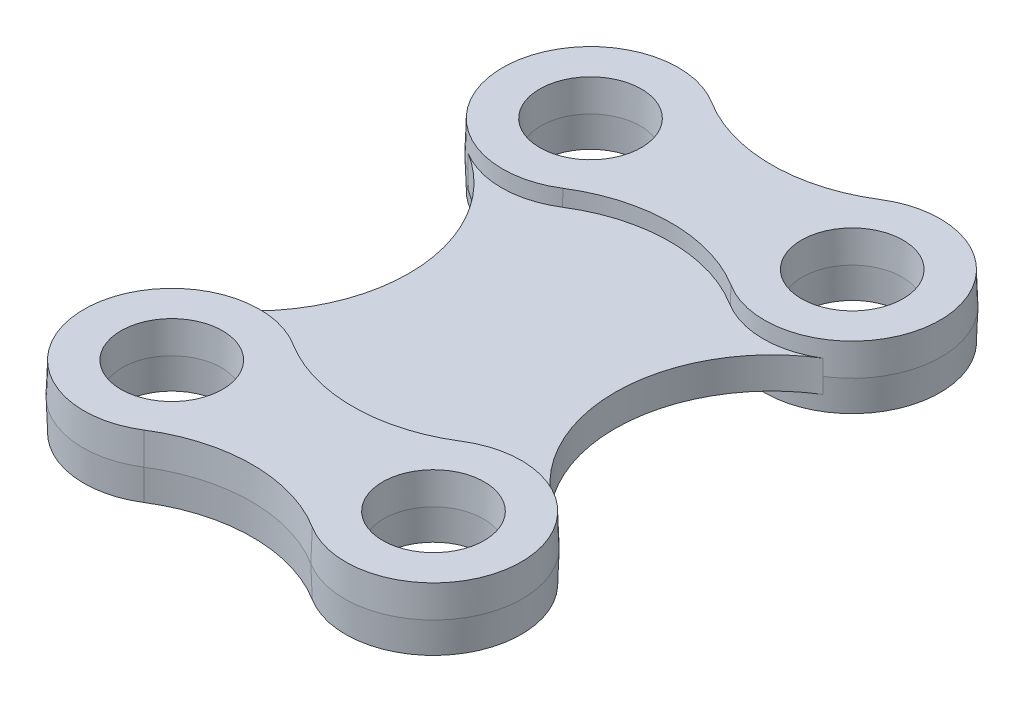
ISO-10303-21;
HEADER;
FILE_DESCRIPTION(('STEP AP214'),'2;1');
FILE_NAME('part.step','',(''),(''),'','','');
FILE_SCHEMA(('AUTOMOTIVE_DESIGN { 1 0 10303 214 1 1 1 1 }'));
ENDSEC;
DATA;
#1=APPLICATION_CONTEXT('core data for automotive mechanical design processes');
#2=APPLICATION_PROTOCOL_DEFINITION('international standard','automotive_design',2000,#1);
#3=PRODUCT_CONTEXT('',#1,'mechanical');
#4=PRODUCT('Part','Part','',(#3));
#5=PRODUCT_RELATED_PRODUCT_CATEGORY('part','',(#4));
#6=PRODUCT_DEFINITION_FORMATION('','',#4);
#7=PRODUCT_DEFINITION_CONTEXT('part definition',#1,'design');
#8=PRODUCT_DEFINITION('design','',#6,#7);
#9=PRODUCT_DEFINITION_SHAPE('','',#8);
#10=(LENGTH_UNIT() NAMED_UNIT(*) SI_UNIT(.MILLI.,.METRE.));
#11=(NAMED_UNIT(*) PLANE_ANGLE_UNIT() SI_UNIT($,.RADIAN.));
#12=(NAMED_UNIT(*) SI_UNIT($,.STERADIAN.) SOLID_ANGLE_UNIT());
#13=UNCERTAINTY_MEASURE_WITH_UNIT(LENGTH_MEASURE(1.E-05),#10,'distance_accuracy_value','');
#14=(GEOMETRIC_REPRESENTATION_CONTEXT(3) GLOBAL_UNCERTAINTY_ASSIGNED_CONTEXT((#13)) GLOBAL_UNIT_ASSIGNED_CONTEXT((#10,
#11,#12)) REPRESENTATION_CONTEXT('',''));
#15=CARTESIAN_POINT('',(0.,0.,0.));
#16=DIRECTION('',(0.,0.,1.));
#17=DIRECTION('',(1.,0.,0.));
#18=AXIS2_PLACEMENT_3D('',#15,#16,#17);
#19=CARTESIAN_POINT('',(0.,0.,0.200502515735196));
#20=DIRECTION('',(0.,-1.,0.));
#21=DIRECTION('',(0.,0.,1.));
#22=AXIS2_PLACEMENT_3D('',#19,#20,#21);
#23=CONICAL_SURFACE('',#22,30.,0.0349065850398867);
#24=CARTESIAN_POINT('',(0.,0.,0.200502515735196));
#25=DIRECTION('',(0.,1.,0.));
#26=DIRECTION('',(0.,0.,1.));
#27=AXIS2_PLACEMENT_3D('',#24,#25,#26);
#28=CIRCLE('',#27,30.);
#29=CARTESIAN_POINT('',(-15.9574468085106,0.,25.6044370801595));
#30=VERTEX_POINT('',#29);
#31=CARTESIAN_POINT('',(15.9574468085106,0.,25.6044370801595));
#32=VERTEX_POINT('',#31);
#33=EDGE_CURVE('E119',#30,#32,#28,.T.);
#34=ORIENTED_EDGE('',*,*,#33,.T.);
#35=DIRECTION('',(-0.0185635620757984,0.999390827019096,-0.0295528176853893));
#36=VECTOR('',#35,1.);
#37=CARTESIAN_POINT('',(15.9574468085107,0.,25.6044370801595));
#38=LINE('',#37,#36);
#39=CARTESIAN_POINT('',(16.068896072846,-6.,25.7818620687811));
#40=VERTEX_POINT('',#39);
#41=EDGE_CURVE('E12',#40,#32,#38,.T.);
#42=ORIENTED_EDGE('',*,*,#41,.F.);
#43=CARTESIAN_POINT('',(0.,-6.,0.200502515735196));
#44=DIRECTION('',(0.,1.,0.));
#45=DIRECTION('',(0.,0.,1.));
#46=AXIS2_PLACEMENT_3D('',#43,#44,#45);
#47=CIRCLE('',#46,30.2095246169505);
#48=CARTESIAN_POINT('',(-16.068896072846,-6.,25.7818620687811));
#49=VERTEX_POINT('',#48);
#50=EDGE_CURVE('E76',#49,#40,#47,.T.);
#51=ORIENTED_EDGE('',*,*,#50,.F.);
#52=DIRECTION('',(0.0185635620757984,0.999390827019096,-0.0295528176853893));
#53=VECTOR('',#52,1.);
#54=CARTESIAN_POINT('',(-15.9574468085106,0.,25.6044370801595));
#55=LINE('',#54,#53);
#56=EDGE_CURVE('E121',#49,#30,#55,.T.);
#57=ORIENTED_EDGE('',*,*,#56,.T.);
#58=EDGE_LOOP('',(#34,#42,#51,#57));
#59=FACE_BOUND('',#58,.T.);
#60=ADVANCED_FACE('F56',(#59),#23,.F.);
#61=CARTESIAN_POINT('',(25.,0.,40.));
#62=DIRECTION('',(0.,1.,0.));
#63=DIRECTION('',(0.,0.,1.));
#64=AXIS2_PLACEMENT_3D('',#61,#62,#63);
#65=CONICAL_SURFACE('',#64,17.,0.0349065850398867);
#66=CARTESIAN_POINT('',(25.,0.,40.));
#67=DIRECTION('',(0.,1.,0.));
#68=DIRECTION('',(0.,0.,1.));
#69=AXIS2_PLACEMENT_3D('',#66,#67,#68);
#70=CIRCLE('',#69,17.);
#71=CARTESIAN_POINT('',(15.9574468085106,0.,54.3955629198405));
#72=VERTEX_POINT('',#71);
#73=EDGE_CURVE('E132',#72,#32,#70,.T.);
#74=ORIENTED_EDGE('',*,*,#73,.F.);
#75=DIRECTION('',(-0.0185635620757984,0.999390827019096,0.0295528176853893));
#76=VECTOR('',#75,1.);
#77=CARTESIAN_POINT('',(15.9574468085106,0.,54.3955629198405));
#78=LINE('',#77,#76);
#79=CARTESIAN_POINT('',(16.068896072846,-6.,54.2181379312189));
#80=VERTEX_POINT('',#79);
#81=EDGE_CURVE('E67',#80,#72,#78,.T.);
#82=ORIENTED_EDGE('',*,*,#81,.F.);
#83=CARTESIAN_POINT('',(25.,-6.,40.));
#84=DIRECTION('',(0.,1.,0.));
#85=DIRECTION('',(0.,0.,1.));
#86=AXIS2_PLACEMENT_3D('',#83,#84,#85);
#87=CIRCLE('',#86,16.7904753830495);
#88=EDGE_CURVE('E134',#80,#40,#87,.T.);
#89=ORIENTED_EDGE('',*,*,#88,.T.);
#90=ORIENTED_EDGE('',*,*,#41,.T.);
#91=EDGE_LOOP('',(#74,#82,#89,#90));
#92=FACE_BOUND('',#91,.T.);
#93=ADVANCED_FACE('F130',(#92),#65,.T.);
#94=CARTESIAN_POINT('',(0.,0.,79.7994974842648));
#95=DIRECTION('',(0.,-1.,0.));
#96=DIRECTION('',(0.,0.,1.));
#97=AXIS2_PLACEMENT_3D('',#94,#95,#96);
#98=CONICAL_SURFACE('',#97,30.,0.0349065850398867);
#99=CARTESIAN_POINT('',(0.,0.,79.7994974842648));
#100=DIRECTION('',(0.,1.,0.));
#101=DIRECTION('',(0.,0.,1.));
#102=AXIS2_PLACEMENT_3D('',#99,#100,#101);
#103=CIRCLE('',#102,30.);
#104=CARTESIAN_POINT('',(-15.9574468085106,0.,54.3955629198405));
#105=VERTEX_POINT('',#104);
#106=EDGE_CURVE('E152',#105,#72,#103,.F.);
#107=ORIENTED_EDGE('',*,*,#106,.F.);
#108=DIRECTION('',(0.0185635620757984,0.999390827019096,0.0295528176853893));
#109=VECTOR('',#108,1.);
#110=CARTESIAN_POINT('',(-15.9574468085106,0.,54.3955629198405));
#111=LINE('',#110,#109);
#112=CARTESIAN_POINT('',(-16.068896072846,-6.,54.2181379312189));
#113=VERTEX_POINT('',#112);
#114=EDGE_CURVE('E89',#113,#105,#111,.T.);
#115=ORIENTED_EDGE('',*,*,#114,.F.);
#116=CARTESIAN_POINT('',(0.,-6.,79.7994974842648));
#117=DIRECTION('',(0.,1.,0.));
#118=DIRECTION('',(0.,0.,1.));
#119=AXIS2_PLACEMENT_3D('',#116,#117,#118);
#120=CIRCLE('',#119,30.2095246169505);
#121=EDGE_CURVE('E172',#113,#80,#120,.F.);
#122=ORIENTED_EDGE('',*,*,#121,.T.);
#123=ORIENTED_EDGE('',*,*,#81,.T.);
#124=EDGE_LOOP('',(#107,#115,#122,#123));
#125=FACE_BOUND('',#124,.T.);
#126=ADVANCED_FACE('F191',(#125),#98,.F.);
#127=CARTESIAN_POINT('',(25.,0.,40.));
#128=DIRECTION('',(0.,-1.,0.));
#129=DIRECTION('',(0.,0.,1.));
#130=AXIS2_PLACEMENT_3D('',#127,#128,#129);
#131=CONICAL_SURFACE('',#130,9.5,0.0349065850398867);
#132=CARTESIAN_POINT('',(25.,-6.,40.));
#133=DIRECTION('',(0.,1.,0.));
#134=DIRECTION('',(0.,0.,1.));
#135=AXIS2_PLACEMENT_3D('',#132,#133,#134);
#136=CIRCLE('',#135,9.70952461695049);
#137=CARTESIAN_POINT('',(25.,-6.,49.7095246169505));
#138=VERTEX_POINT('',#137);
#139=EDGE_CURVE('E60',#138,#138,#136,.T.);
#140=ORIENTED_EDGE('',*,*,#139,.F.);
#141=EDGE_LOOP('',(#140));
#142=FACE_BOUND('',#141,.T.);
#143=CARTESIAN_POINT('',(25.,0.,40.));
#144=DIRECTION('',(0.,1.,0.));
#145=DIRECTION('',(0.,0.,1.));
#146=AXIS2_PLACEMENT_3D('',#143,#144,#145);
#147=CIRCLE('',#146,9.5);
#148=CARTESIAN_POINT('',(25.,0.,49.5));
#149=VERTEX_POINT('',#148);
#150=EDGE_CURVE('E194',#149,#149,#147,.T.);
#151=ORIENTED_EDGE('',*,*,#150,.T.);
#152=EDGE_LOOP('',(#151));
#153=FACE_BOUND('',#152,.T.);
#154=ADVANCED_FACE('F187',(#142,#153),#131,.F.);
#155=CARTESIAN_POINT('',(-25.,0.,40.));
#156=DIRECTION('',(0.,1.,0.));
#157=DIRECTION('',(0.,0.,1.));
#158=AXIS2_PLACEMENT_3D('',#155,#156,#157);
#159=CONICAL_SURFACE('',#158,17.,0.0349065850398867);
#160=CARTESIAN_POINT('',(-25.,0.,40.));
#161=DIRECTION('',(0.,1.,0.));
#162=DIRECTION('',(0.,0.,1.));
#163=AXIS2_PLACEMENT_3D('',#160,#161,#162);
#164=CIRCLE('',#163,17.);
#165=EDGE_CURVE('E126',#105,#30,#164,.F.);
#166=ORIENTED_EDGE('',*,*,#165,.T.);
#167=ORIENTED_EDGE('',*,*,#56,.F.);
#168=CARTESIAN_POINT('',(-25.,-6.,40.));
#169=DIRECTION('',(0.,1.,0.));
#170=DIRECTION('',(0.,0.,1.));
#171=AXIS2_PLACEMENT_3D('',#168,#169,#170);
#172=CIRCLE('',#171,16.7904753830495);
#173=EDGE_CURVE('E92',#113,#49,#172,.F.);
#174=ORIENTED_EDGE('',*,*,#173,.F.);
#175=ORIENTED_EDGE('',*,*,#114,.T.);
#176=EDGE_LOOP('',(#166,#167,#174,#175));
#177=FACE_BOUND('',#176,.T.);
#178=ADVANCED_FACE('F190',(#177),#159,.T.);
#179=CARTESIAN_POINT('',(-25.,0.,40.));
#180=DIRECTION('',(0.,-1.,0.));
#181=DIRECTION('',(0.,0.,1.));
#182=AXIS2_PLACEMENT_3D('',#179,#180,#181);
#183=CONICAL_SURFACE('',#182,9.5,0.0349065850398867);
#184=CARTESIAN_POINT('',(-25.,-6.,40.));
#185=DIRECTION('',(0.,1.,0.));
#186=DIRECTION('',(0.,0.,1.));
#187=AXIS2_PLACEMENT_3D('',#184,#185,#186);
#188=CIRCLE('',#187,9.70952461695049);
#189=CARTESIAN_POINT('',(-25.,-6.,49.7095246169505));
#190=VERTEX_POINT('',#189);
#191=EDGE_CURVE('E163',#190,#190,#188,.F.);
#192=ORIENTED_EDGE('',*,*,#191,.T.);
#193=EDGE_LOOP('',(#192));
#194=FACE_BOUND('',#193,.T.);
#195=CARTESIAN_POINT('',(-25.,0.,40.));
#196=DIRECTION('',(0.,1.,0.));
#197=DIRECTION('',(0.,0.,1.));
#198=AXIS2_PLACEMENT_3D('',#195,#196,#197);
#199=CIRCLE('',#198,9.5);
#200=CARTESIAN_POINT('',(-25.,0.,49.5));
#201=VERTEX_POINT('',#200);
#202=EDGE_CURVE('E151',#201,#201,#199,.F.);
#203=ORIENTED_EDGE('',*,*,#202,.F.);
#204=EDGE_LOOP('',(#203));
#205=FACE_BOUND('',#204,.T.);
#206=ADVANCED_FACE('F58',(#194,#205),#183,.F.);
#207=CARTESIAN_POINT('',(0.,-6.,0.));
#208=DIRECTION('',(0.,1.,0.));
#209=DIRECTION('',(0.,0.,1.));
#210=AXIS2_PLACEMENT_3D('',#207,#208,#209);
#211=PLANE('',#210);
#212=ORIENTED_EDGE('',*,*,#50,.T.);
#213=ORIENTED_EDGE('',*,*,#88,.F.);
#214=ORIENTED_EDGE('',*,*,#121,.F.);
#215=ORIENTED_EDGE('',*,*,#173,.T.);
#216=EDGE_LOOP('',(#212,#213,#214,#215));
#217=FACE_BOUND('',#216,.T.);
#218=ORIENTED_EDGE('',*,*,#139,.T.);
#219=EDGE_LOOP('',(#218));
#220=FACE_BOUND('',#219,.T.);
#221=ORIENTED_EDGE('',*,*,#191,.F.);
#222=EDGE_LOOP('',(#221));
#223=FACE_BOUND('',#222,.T.);
#224=ADVANCED_FACE('F184',(#217,#220,#223),#211,.F.);
#225=CARTESIAN_POINT('',(0.,0.,0.200502515735196));
#226=DIRECTION('',(0.,1.,0.));
#227=DIRECTION('',(0.,0.,1.));
#228=AXIS2_PLACEMENT_3D('',#225,#226,#227);
#229=CONICAL_SURFACE('',#228,30.,0.0349065850398867);
#230=ORIENTED_EDGE('',*,*,#33,.F.);
#231=DIRECTION('',(0.0185635620757984,-0.999390827019096,-0.0295528176853893));
#232=VECTOR('',#231,1.);
#233=CARTESIAN_POINT('',(-15.9574468085106,0.,25.6044370801595));
#234=LINE('',#233,#232);
#235=CARTESIAN_POINT('',(-16.068896072846,6.,25.7818620687811));
#236=VERTEX_POINT('',#235);
#237=EDGE_CURVE('E127',#236,#30,#234,.T.);
#238=ORIENTED_EDGE('',*,*,#237,.F.);
#239=CARTESIAN_POINT('',(0.,6.,0.200502515735196));
#240=DIRECTION('',(0.,1.,0.));
#241=DIRECTION('',(0.,0.,1.));
#242=AXIS2_PLACEMENT_3D('',#239,#240,#241);
#243=CIRCLE('',#242,30.2095246169505);
#244=CARTESIAN_POINT('',(16.068896072846,6.,25.7818620687811));
#245=VERTEX_POINT('',#244);
#246=EDGE_CURVE('E140',#236,#245,#243,.T.);
#247=ORIENTED_EDGE('',*,*,#246,.T.);
#248=DIRECTION('',(-0.0185635620757984,-0.999390827019096,-0.0295528176853893));
#249=VECTOR('',#248,1.);
#250=CARTESIAN_POINT('',(15.9574468085106,0.,25.6044370801595));
#251=LINE('',#250,#249);
#252=EDGE_CURVE('E137',#245,#32,#251,.T.);
#253=ORIENTED_EDGE('',*,*,#252,.T.);
#254=EDGE_LOOP('',(#230,#238,#247,#253));
#255=FACE_BOUND('',#254,.T.);
#256=ADVANCED_FACE('F138',(#255),#229,.F.);
#257=CARTESIAN_POINT('',(-25.,0.,40.));
#258=DIRECTION('',(0.,-1.,0.));
#259=DIRECTION('',(0.,0.,1.));
#260=AXIS2_PLACEMENT_3D('',#257,#258,#259);
#261=CONICAL_SURFACE('',#260,17.,0.0349065850398867);
#262=ORIENTED_EDGE('',*,*,#165,.F.);
#263=DIRECTION('',(0.0185635620757984,-0.999390827019096,0.0295528176853893));
#264=VECTOR('',#263,1.);
#265=CARTESIAN_POINT('',(-15.9574468085106,0.,54.3955629198405));
#266=LINE('',#265,#264);
#267=CARTESIAN_POINT('',(-16.068896072846,6.,54.2181379312189));
#268=VERTEX_POINT('',#267);
#269=EDGE_CURVE('E203',#268,#105,#266,.T.);
#270=ORIENTED_EDGE('',*,*,#269,.F.);
#271=CARTESIAN_POINT('',(-25.,6.,40.));
#272=DIRECTION('',(0.,1.,0.));
#273=DIRECTION('',(0.,0.,1.));
#274=AXIS2_PLACEMENT_3D('',#271,#272,#273);
#275=CIRCLE('',#274,16.7904753830495);
#276=EDGE_CURVE('E199',#268,#236,#275,.F.);
#277=ORIENTED_EDGE('',*,*,#276,.T.);
#278=ORIENTED_EDGE('',*,*,#237,.T.);
#279=EDGE_LOOP('',(#262,#270,#277,#278));
#280=FACE_BOUND('',#279,.T.);
#281=ADVANCED_FACE('F228',(#280),#261,.T.);
#282=CARTESIAN_POINT('',(0.,0.,79.7994974842648));
#283=DIRECTION('',(0.,1.,0.));
#284=DIRECTION('',(0.,0.,1.));
#285=AXIS2_PLACEMENT_3D('',#282,#283,#284);
#286=CONICAL_SURFACE('',#285,30.,0.0349065850398867);
#287=ORIENTED_EDGE('',*,*,#106,.T.);
#288=DIRECTION('',(-0.0185635620757984,-0.999390827019096,0.0295528176853893));
#289=VECTOR('',#288,1.);
#290=CARTESIAN_POINT('',(15.9574468085106,0.,54.3955629198405));
#291=LINE('',#290,#289);
#292=CARTESIAN_POINT('',(16.068896072846,6.,54.2181379312189));
#293=VERTEX_POINT('',#292);
#294=EDGE_CURVE('E144',#293,#72,#291,.T.);
#295=ORIENTED_EDGE('',*,*,#294,.F.);
#296=CARTESIAN_POINT('',(0.,6.,79.7994974842648));
#297=DIRECTION('',(0.,1.,0.));
#298=DIRECTION('',(0.,0.,1.));
#299=AXIS2_PLACEMENT_3D('',#296,#297,#298);
#300=CIRCLE('',#299,30.2095246169505);
#301=EDGE_CURVE('E213',#268,#293,#300,.F.);
#302=ORIENTED_EDGE('',*,*,#301,.F.);
#303=ORIENTED_EDGE('',*,*,#269,.T.);
#304=EDGE_LOOP('',(#287,#295,#302,#303));
#305=FACE_BOUND('',#304,.T.);
#306=ADVANCED_FACE('F235',(#305),#286,.F.);
#307=CARTESIAN_POINT('',(25.,0.,40.));
#308=DIRECTION('',(0.,1.,0.));
#309=DIRECTION('',(0.,0.,1.));
#310=AXIS2_PLACEMENT_3D('',#307,#308,#309);
#311=CONICAL_SURFACE('',#310,9.5,0.0349065850398867);
#312=CARTESIAN_POINT('',(25.,6.,40.));
#313=DIRECTION('',(0.,1.,0.));
#314=DIRECTION('',(0.,0.,1.));
#315=AXIS2_PLACEMENT_3D('',#312,#313,#314);
#316=CIRCLE('',#315,9.70952461695049);
#317=CARTESIAN_POINT('',(25.,6.,49.7095246169505));
#318=VERTEX_POINT('',#317);
#319=EDGE_CURVE('E219',#318,#318,#316,.T.);
#320=ORIENTED_EDGE('',*,*,#319,.T.);
#321=EDGE_LOOP('',(#320));
#322=FACE_BOUND('',#321,.T.);
#323=ORIENTED_EDGE('',*,*,#150,.F.);
#324=EDGE_LOOP('',(#323));
#325=FACE_BOUND('',#324,.T.);
#326=ADVANCED_FACE('F267',(#322,#325),#311,.F.);
#327=CARTESIAN_POINT('',(25.,0.,40.));
#328=DIRECTION('',(0.,-1.,0.));
#329=DIRECTION('',(0.,0.,1.));
#330=AXIS2_PLACEMENT_3D('',#327,#328,#329);
#331=CONICAL_SURFACE('',#330,17.,0.0349065850398867);
#332=ORIENTED_EDGE('',*,*,#73,.T.);
#333=ORIENTED_EDGE('',*,*,#252,.F.);
#334=CARTESIAN_POINT('',(25.,6.,40.));
#335=DIRECTION('',(0.,1.,0.));
#336=DIRECTION('',(0.,0.,1.));
#337=AXIS2_PLACEMENT_3D('',#334,#335,#336);
#338=CIRCLE('',#337,16.7904753830495);
#339=EDGE_CURVE('E216',#293,#245,#338,.T.);
#340=ORIENTED_EDGE('',*,*,#339,.F.);
#341=ORIENTED_EDGE('',*,*,#294,.T.);
#342=EDGE_LOOP('',(#332,#333,#340,#341));
#343=FACE_BOUND('',#342,.T.);
#344=ADVANCED_FACE('F148',(#343),#331,.T.);
#345=CARTESIAN_POINT('',(-25.,0.,40.));
#346=DIRECTION('',(0.,1.,0.));
#347=DIRECTION('',(0.,0.,1.));
#348=AXIS2_PLACEMENT_3D('',#345,#346,#347);
#349=CONICAL_SURFACE('',#348,9.5,0.0349065850398867);
#350=CARTESIAN_POINT('',(-25.,6.,40.));
#351=DIRECTION('',(0.,1.,0.));
#352=DIRECTION('',(0.,0.,1.));
#353=AXIS2_PLACEMENT_3D('',#350,#351,#352);
#354=CIRCLE('',#353,9.70952461695049);
#355=CARTESIAN_POINT('',(-25.,6.,49.7095246169505));
#356=VERTEX_POINT('',#355);
#357=EDGE_CURVE('E145',#356,#356,#354,.F.);
#358=ORIENTED_EDGE('',*,*,#357,.F.);
#359=EDGE_LOOP('',(#358));
#360=FACE_BOUND('',#359,.T.);
#361=ORIENTED_EDGE('',*,*,#202,.T.);
#362=EDGE_LOOP('',(#361));
#363=FACE_BOUND('',#362,.T.);
#364=ADVANCED_FACE('F259',(#360,#363),#349,.F.);
#365=CARTESIAN_POINT('',(0.,6.,0.));
#366=DIRECTION('',(0.,1.,0.));
#367=DIRECTION('',(0.,0.,1.));
#368=AXIS2_PLACEMENT_3D('',#365,#366,#367);
#369=PLANE('',#368);
#370=ORIENTED_EDGE('',*,*,#246,.F.);
#371=ORIENTED_EDGE('',*,*,#276,.F.);
#372=ORIENTED_EDGE('',*,*,#301,.T.);
#373=ORIENTED_EDGE('',*,*,#339,.T.);
#374=EDGE_LOOP('',(#370,#371,#372,#373));
#375=FACE_BOUND('',#374,.T.);
#376=ORIENTED_EDGE('',*,*,#319,.F.);
#377=EDGE_LOOP('',(#376));
#378=FACE_BOUND('',#377,.T.);
#379=ORIENTED_EDGE('',*,*,#357,.T.);
#380=EDGE_LOOP('',(#379));
#381=FACE_BOUND('',#380,.T.);
#382=ADVANCED_FACE('F232',(#375,#378,#381),#369,.T.);
#383=CLOSED_SHELL('',(#60,#93,#126,#154,#178,#206,#224,#256,#281,#306,#326,#344,#364,#382));
#384=MANIFOLD_SOLID_BREP('B2',#383);
#385=CARTESIAN_POINT('',(25.,0.,-40.));
#386=DIRECTION('',(0.,1.,0.));
#387=DIRECTION('',(0.,0.,1.));
#388=AXIS2_PLACEMENT_3D('',#385,#386,#387);
#389=CONICAL_SURFACE('',#388,17.,0.0349065850398867);
#390=CARTESIAN_POINT('',(25.,0.,-40.));
#391=DIRECTION('',(0.,1.,0.));
#392=DIRECTION('',(0.,0.,1.));
#393=AXIS2_PLACEMENT_3D('',#390,#391,#392);
#394=CIRCLE('',#393,17.);
#395=CARTESIAN_POINT('',(15.9574468085106,0.,-54.3955629198404));
#396=VERTEX_POINT('',#395);
#397=CARTESIAN_POINT('',(15.9574468085106,0.,-25.6044370801595));
#398=VERTEX_POINT('',#397);
#399=EDGE_CURVE('E428',#396,#398,#394,.F.);
#400=ORIENTED_EDGE('',*,*,#399,.T.);
#401=DIRECTION('',(-0.0185635620757984,0.999390827019096,0.0295528176853893));
#402=VECTOR('',#401,1.);
#403=CARTESIAN_POINT('',(15.9574468085106,0.,-25.6044370801595));
#404=LINE('',#403,#402);
#405=CARTESIAN_POINT('',(16.068896072846,-6.,-25.7818620687811));
#406=VERTEX_POINT('',#405);
#407=EDGE_CURVE('E54',#406,#398,#404,.T.);
#408=ORIENTED_EDGE('',*,*,#407,.F.);
#409=CARTESIAN_POINT('',(25.,-6.,-40.));
#410=DIRECTION('',(0.,1.,0.));
#411=DIRECTION('',(0.,0.,1.));
#412=AXIS2_PLACEMENT_3D('',#409,#410,#411);
#413=CIRCLE('',#412,16.7904753830495);
#414=CARTESIAN_POINT('',(16.068896072846,-6.,-54.2181379312189));
#415=VERTEX_POINT('',#414);
#416=EDGE_CURVE('E386',#415,#406,#413,.F.);
#417=ORIENTED_EDGE('',*,*,#416,.F.);
#418=DIRECTION('',(-0.0185635620757984,0.999390827019096,-0.0295528176853893));
#419=VECTOR('',#418,1.);
#420=CARTESIAN_POINT('',(15.9574468085106,0.,-54.3955629198405));
#421=LINE('',#420,#419);
#422=EDGE_CURVE('E430',#415,#396,#421,.T.);
#423=ORIENTED_EDGE('',*,*,#422,.T.);
#424=EDGE_LOOP('',(#400,#408,#417,#423));
#425=FACE_BOUND('',#424,.T.);
#426=ADVANCED_FACE('F367',(#425),#389,.T.);
#427=CARTESIAN_POINT('',(0.,0.,-0.200502515735196));
#428=DIRECTION('',(0.,-1.,0.));
#429=DIRECTION('',(0.,0.,1.));
#430=AXIS2_PLACEMENT_3D('',#427,#428,#429);
#431=CONICAL_SURFACE('',#430,30.,0.0349065850398867);
#432=CARTESIAN_POINT('',(0.,0.,-0.200502515735196));
#433=DIRECTION('',(0.,1.,0.));
#434=DIRECTION('',(0.,0.,1.));
#435=AXIS2_PLACEMENT_3D('',#432,#433,#434);
#436=CIRCLE('',#435,30.);
#437=CARTESIAN_POINT('',(-15.9574468085106,0.,-25.6044370801595));
#438=VERTEX_POINT('',#437);
#439=EDGE_CURVE('E440',#438,#398,#436,.F.);
#440=ORIENTED_EDGE('',*,*,#439,.F.);
#441=DIRECTION('',(0.0185635620757984,0.999390827019096,0.0295528176853893));
#442=VECTOR('',#441,1.);
#443=CARTESIAN_POINT('',(-15.9574468085107,0.,-25.6044370801595));
#444=LINE('',#443,#442);
#445=CARTESIAN_POINT('',(-16.068896072846,-6.,-25.7818620687811));
#446=VERTEX_POINT('',#445);
#447=EDGE_CURVE('E377',#446,#438,#444,.T.);
#448=ORIENTED_EDGE('',*,*,#447,.F.);
#449=CARTESIAN_POINT('',(0.,-6.,-0.200502515735196));
#450=DIRECTION('',(0.,1.,0.));
#451=DIRECTION('',(0.,0.,1.));
#452=AXIS2_PLACEMENT_3D('',#449,#450,#451);
#453=CIRCLE('',#452,30.2095246169505);
#454=EDGE_CURVE('E442',#446,#406,#453,.F.);
#455=ORIENTED_EDGE('',*,*,#454,.T.);
#456=ORIENTED_EDGE('',*,*,#407,.T.);
#457=EDGE_LOOP('',(#440,#448,#455,#456));
#458=FACE_BOUND('',#457,.T.);
#459=ADVANCED_FACE('F438',(#458),#431,.F.);
#460=CARTESIAN_POINT('',(-25.,0.,-40.));
#461=DIRECTION('',(0.,1.,0.));
#462=DIRECTION('',(0.,0.,1.));
#463=AXIS2_PLACEMENT_3D('',#460,#461,#462);
#464=CONICAL_SURFACE('',#463,17.,0.0349065850398867);
#465=CARTESIAN_POINT('',(-25.,0.,-40.));
#466=DIRECTION('',(0.,1.,0.));
#467=DIRECTION('',(0.,0.,1.));
#468=AXIS2_PLACEMENT_3D('',#465,#466,#467);
#469=CIRCLE('',#468,17.);
#470=CARTESIAN_POINT('',(-15.9574468085107,0.,-54.3955629198405));
#471=VERTEX_POINT('',#470);
#472=EDGE_CURVE('E457',#471,#438,#469,.T.);
#473=ORIENTED_EDGE('',*,*,#472,.F.);
#474=DIRECTION('',(0.0185635620757984,0.999390827019096,-0.0295528176853893));
#475=VECTOR('',#474,1.);
#476=CARTESIAN_POINT('',(-15.9574468085107,0.,-54.3955629198405));
#477=LINE('',#476,#475);
#478=CARTESIAN_POINT('',(-16.068896072846,-6.,-54.2181379312189));
#479=VERTEX_POINT('',#478);
#480=EDGE_CURVE('E399',#479,#471,#477,.T.);
#481=ORIENTED_EDGE('',*,*,#480,.F.);
#482=CARTESIAN_POINT('',(-25.,-6.,-40.));
#483=DIRECTION('',(0.,1.,0.));
#484=DIRECTION('',(0.,0.,1.));
#485=AXIS2_PLACEMENT_3D('',#482,#483,#484);
#486=CIRCLE('',#485,16.7904753830495);
#487=EDGE_CURVE('E474',#479,#446,#486,.T.);
#488=ORIENTED_EDGE('',*,*,#487,.T.);
#489=ORIENTED_EDGE('',*,*,#447,.T.);
#490=EDGE_LOOP('',(#473,#481,#488,#489));
#491=FACE_BOUND('',#490,.T.);
#492=ADVANCED_FACE('F475',(#491),#464,.T.);
#493=CARTESIAN_POINT('',(0.,0.,-79.7994974842648));
#494=DIRECTION('',(0.,-1.,0.));
#495=DIRECTION('',(0.,0.,1.));
#496=AXIS2_PLACEMENT_3D('',#493,#494,#495);
#497=CONICAL_SURFACE('',#496,30.,0.0349065850398867);
#498=CARTESIAN_POINT('',(0.,0.,-79.7994974842648));
#499=DIRECTION('',(0.,1.,0.));
#500=DIRECTION('',(0.,0.,1.));
#501=AXIS2_PLACEMENT_3D('',#498,#499,#500);
#502=CIRCLE('',#501,30.);
#503=EDGE_CURVE('E434',#471,#396,#502,.T.);
#504=ORIENTED_EDGE('',*,*,#503,.T.);
#505=ORIENTED_EDGE('',*,*,#422,.F.);
#506=CARTESIAN_POINT('',(0.,-6.,-79.7994974842648));
#507=DIRECTION('',(0.,1.,0.));
#508=DIRECTION('',(0.,0.,1.));
#509=AXIS2_PLACEMENT_3D('',#506,#507,#508);
#510=CIRCLE('',#509,30.2095246169505);
#511=EDGE_CURVE('E371',#479,#415,#510,.T.);
#512=ORIENTED_EDGE('',*,*,#511,.F.);
#513=ORIENTED_EDGE('',*,*,#480,.T.);
#514=EDGE_LOOP('',(#504,#505,#512,#513));
#515=FACE_BOUND('',#514,.T.);
#516=ADVANCED_FACE('F511',(#515),#497,.F.);
#517=CARTESIAN_POINT('',(-25.,0.,-40.));
#518=DIRECTION('',(0.,-1.,0.));
#519=DIRECTION('',(0.,0.,1.));
#520=AXIS2_PLACEMENT_3D('',#517,#518,#519);
#521=CONICAL_SURFACE('',#520,9.5,0.0349065850398867);
#522=CARTESIAN_POINT('',(-25.,-6.,-40.));
#523=DIRECTION('',(0.,1.,0.));
#524=DIRECTION('',(0.,0.,1.));
#525=AXIS2_PLACEMENT_3D('',#522,#523,#524);
#526=CIRCLE('',#525,9.70952461695049);
#527=CARTESIAN_POINT('',(-25.,-6.,-30.2904753830495));
#528=VERTEX_POINT('',#527);
#529=EDGE_CURVE('E460',#528,#528,#526,.T.);
#530=ORIENTED_EDGE('',*,*,#529,.F.);
#531=EDGE_LOOP('',(#530));
#532=FACE_BOUND('',#531,.T.);
#533=CARTESIAN_POINT('',(-25.,0.,-40.));
#534=DIRECTION('',(0.,1.,0.));
#535=DIRECTION('',(0.,0.,1.));
#536=AXIS2_PLACEMENT_3D('',#533,#534,#535);
#537=CIRCLE('',#536,9.5);
#538=CARTESIAN_POINT('',(-25.,0.,-30.5));
#539=VERTEX_POINT('',#538);
#540=EDGE_CURVE('E631',#539,#539,#537,.T.);
#541=ORIENTED_EDGE('',*,*,#540,.T.);
#542=EDGE_LOOP('',(#541));
#543=FACE_BOUND('',#542,.T.);
#544=ADVANCED_FACE('F485',(#532,#543),#521,.F.);
#545=CARTESIAN_POINT('',(25.,0.,-40.));
#546=DIRECTION('',(0.,-1.,0.));
#547=DIRECTION('',(0.,0.,1.));
#548=AXIS2_PLACEMENT_3D('',#545,#546,#547);
#549=CONICAL_SURFACE('',#548,9.5,0.0349065850398867);
#550=CARTESIAN_POINT('',(25.,-6.,-40.));
#551=DIRECTION('',(0.,1.,0.));
#552=DIRECTION('',(0.,0.,1.));
#553=AXIS2_PLACEMENT_3D('',#550,#551,#552);
#554=CIRCLE('',#553,9.70952461695049);
#555=CARTESIAN_POINT('',(25.,-6.,-30.2904753830495));
#556=VERTEX_POINT('',#555);
#557=EDGE_CURVE('E467',#556,#556,#554,.F.);
#558=ORIENTED_EDGE('',*,*,#557,.T.);
#559=EDGE_LOOP('',(#558));
#560=FACE_BOUND('',#559,.T.);
#561=CARTESIAN_POINT('',(25.,0.,-40.));
#562=DIRECTION('',(0.,1.,0.));
#563=DIRECTION('',(0.,0.,1.));
#564=AXIS2_PLACEMENT_3D('',#561,#562,#563);
#565=CIRCLE('',#564,9.5);
#566=CARTESIAN_POINT('',(25.,0.,-30.5));
#567=VERTEX_POINT('',#566);
#568=EDGE_CURVE('E456',#567,#567,#565,.F.);
#569=ORIENTED_EDGE('',*,*,#568,.F.);
#570=EDGE_LOOP('',(#569));
#571=FACE_BOUND('',#570,.T.);
#572=ADVANCED_FACE('F369',(#560,#571),#549,.F.);
#573=CARTESIAN_POINT('',(0.,-6.,0.));
#574=DIRECTION('',(0.,1.,0.));
#575=DIRECTION('',(0.,0.,1.));
#576=AXIS2_PLACEMENT_3D('',#573,#574,#575);
#577=PLANE('',#576);
#578=ORIENTED_EDGE('',*,*,#529,.T.);
#579=EDGE_LOOP('',(#578));
#580=FACE_BOUND('',#579,.T.);
#581=ORIENTED_EDGE('',*,*,#416,.T.);
#582=ORIENTED_EDGE('',*,*,#454,.F.);
#583=ORIENTED_EDGE('',*,*,#487,.F.);
#584=ORIENTED_EDGE('',*,*,#511,.T.);
#585=EDGE_LOOP('',(#581,#582,#583,#584));
#586=FACE_BOUND('',#585,.T.);
#587=ORIENTED_EDGE('',*,*,#557,.F.);
#588=EDGE_LOOP('',(#587));
#589=FACE_BOUND('',#588,.T.);
#590=ADVANCED_FACE('F476',(#580,#586,#589),#577,.F.);
#591=CARTESIAN_POINT('',(25.,0.,-40.));
#592=DIRECTION('',(0.,-1.,0.));
#593=DIRECTION('',(0.,0.,1.));
#594=AXIS2_PLACEMENT_3D('',#591,#592,#593);
#595=CONICAL_SURFACE('',#594,17.,0.0349065850398867);
#596=ORIENTED_EDGE('',*,*,#399,.F.);
#597=DIRECTION('',(-0.0185635620757984,-0.999390827019096,-0.0295528176853893));
#598=VECTOR('',#597,1.);
#599=CARTESIAN_POINT('',(15.9574468085106,0.,-54.3955629198405));
#600=LINE('',#599,#598);
#601=CARTESIAN_POINT('',(16.068896072846,6.,-54.2181379312189));
#602=VERTEX_POINT('',#601);
#603=EDGE_CURVE('E435',#602,#396,#600,.T.);
#604=ORIENTED_EDGE('',*,*,#603,.F.);
#605=CARTESIAN_POINT('',(25.,6.,-40.));
#606=DIRECTION('',(0.,1.,0.));
#607=DIRECTION('',(0.,0.,1.));
#608=AXIS2_PLACEMENT_3D('',#605,#606,#607);
#609=CIRCLE('',#608,16.7904753830495);
#610=CARTESIAN_POINT('',(16.068896072846,6.,-25.7818620687811));
#611=VERTEX_POINT('',#610);
#612=EDGE_CURVE('E448',#602,#611,#609,.F.);
#613=ORIENTED_EDGE('',*,*,#612,.T.);
#614=DIRECTION('',(-0.0185635620757984,-0.999390827019096,0.0295528176853893));
#615=VECTOR('',#614,1.);
#616=CARTESIAN_POINT('',(15.9574468085106,0.,-25.6044370801595));
#617=LINE('',#616,#615);
#618=EDGE_CURVE('E445',#611,#398,#617,.T.);
#619=ORIENTED_EDGE('',*,*,#618,.T.);
#620=EDGE_LOOP('',(#596,#604,#613,#619));
#621=FACE_BOUND('',#620,.T.);
#622=ADVANCED_FACE('F446',(#621),#595,.T.);
#623=CARTESIAN_POINT('',(0.,0.,-79.7994974842648));
#624=DIRECTION('',(0.,1.,0.));
#625=DIRECTION('',(0.,0.,1.));
#626=AXIS2_PLACEMENT_3D('',#623,#624,#625);
#627=CONICAL_SURFACE('',#626,30.,0.0349065850398867);
#628=ORIENTED_EDGE('',*,*,#503,.F.);
#629=DIRECTION('',(0.0185635620757984,-0.999390827019096,-0.0295528176853893));
#630=VECTOR('',#629,1.);
#631=CARTESIAN_POINT('',(-15.9574468085106,0.,-54.3955629198405));
#632=LINE('',#631,#630);
#633=CARTESIAN_POINT('',(-16.068896072846,6.,-54.2181379312189));
#634=VERTEX_POINT('',#633);
#635=EDGE_CURVE('E610',#634,#471,#632,.T.);
#636=ORIENTED_EDGE('',*,*,#635,.F.);
#637=CARTESIAN_POINT('',(0.,6.,-79.7994974842648));
#638=DIRECTION('',(0.,1.,0.));
#639=DIRECTION('',(0.,0.,1.));
#640=AXIS2_PLACEMENT_3D('',#637,#638,#639);
#641=CIRCLE('',#640,30.2095246169505);
#642=EDGE_CURVE('E621',#634,#602,#641,.T.);
#643=ORIENTED_EDGE('',*,*,#642,.T.);
#644=ORIENTED_EDGE('',*,*,#603,.T.);
#645=EDGE_LOOP('',(#628,#636,#643,#644));
#646=FACE_BOUND('',#645,.T.);
#647=ADVANCED_FACE('F548',(#646),#627,.F.);
#648=CARTESIAN_POINT('',(-25.,0.,-40.));
#649=DIRECTION('',(0.,-1.,0.));
#650=DIRECTION('',(0.,0.,1.));
#651=AXIS2_PLACEMENT_3D('',#648,#649,#650);
#652=CONICAL_SURFACE('',#651,17.,0.0349065850398867);
#653=ORIENTED_EDGE('',*,*,#472,.T.);
#654=DIRECTION('',(0.0185635620757984,-0.999390827019096,0.0295528176853893));
#655=VECTOR('',#654,1.);
#656=CARTESIAN_POINT('',(-15.9574468085106,0.,-25.6044370801595));
#657=LINE('',#656,#655);
#658=CARTESIAN_POINT('',(-16.068896072846,6.,-25.7818620687811));
#659=VERTEX_POINT('',#658);
#660=EDGE_CURVE('E450',#659,#438,#657,.T.);
#661=ORIENTED_EDGE('',*,*,#660,.F.);
#662=CARTESIAN_POINT('',(-25.,6.,-40.));
#663=DIRECTION('',(0.,1.,0.));
#664=DIRECTION('',(0.,0.,1.));
#665=AXIS2_PLACEMENT_3D('',#662,#663,#664);
#666=CIRCLE('',#665,16.7904753830495);
#667=EDGE_CURVE('E613',#634,#659,#666,.T.);
#668=ORIENTED_EDGE('',*,*,#667,.F.);
#669=ORIENTED_EDGE('',*,*,#635,.T.);
#670=EDGE_LOOP('',(#653,#661,#668,#669));
#671=FACE_BOUND('',#670,.T.);
#672=ADVANCED_FACE('F556',(#671),#652,.T.);
#673=CARTESIAN_POINT('',(0.,0.,-0.200502515735196));
#674=DIRECTION('',(0.,1.,0.));
#675=DIRECTION('',(0.,0.,1.));
#676=AXIS2_PLACEMENT_3D('',#673,#674,#675);
#677=CONICAL_SURFACE('',#676,30.,0.0349065850398867);
#678=ORIENTED_EDGE('',*,*,#439,.T.);
#679=ORIENTED_EDGE('',*,*,#618,.F.);
#680=CARTESIAN_POINT('',(0.,6.,-0.200502515735196));
#681=DIRECTION('',(0.,1.,0.));
#682=DIRECTION('',(0.,0.,1.));
#683=AXIS2_PLACEMENT_3D('',#680,#681,#682);
#684=CIRCLE('',#683,30.2095246169505);
#685=EDGE_CURVE('E618',#659,#611,#684,.F.);
#686=ORIENTED_EDGE('',*,*,#685,.F.);
#687=ORIENTED_EDGE('',*,*,#660,.T.);
#688=EDGE_LOOP('',(#678,#679,#686,#687));
#689=FACE_BOUND('',#688,.T.);
#690=ADVANCED_FACE('F453',(#689),#677,.F.);
#691=CARTESIAN_POINT('',(-25.,0.,-40.));
#692=DIRECTION('',(0.,1.,0.));
#693=DIRECTION('',(0.,0.,1.));
#694=AXIS2_PLACEMENT_3D('',#691,#692,#693);
#695=CONICAL_SURFACE('',#694,9.5,0.0349065850398867);
#696=CARTESIAN_POINT('',(-25.,6.,-40.));
#697=DIRECTION('',(0.,1.,0.));
#698=DIRECTION('',(0.,0.,1.));
#699=AXIS2_PLACEMENT_3D('',#696,#697,#698);
#700=CIRCLE('',#699,9.70952461695049);
#701=CARTESIAN_POINT('',(-25.,6.,-30.2904753830495));
#702=VERTEX_POINT('',#701);
#703=EDGE_CURVE('E623',#702,#702,#700,.T.);
#704=ORIENTED_EDGE('',*,*,#703,.T.);
#705=EDGE_LOOP('',(#704));
#706=FACE_BOUND('',#705,.T.);
#707=ORIENTED_EDGE('',*,*,#540,.F.);
#708=EDGE_LOOP('',(#707));
#709=FACE_BOUND('',#708,.T.);
#710=ADVANCED_FACE('F491',(#706,#709),#695,.F.);
#711=CARTESIAN_POINT('',(25.,0.,-40.));
#712=DIRECTION('',(0.,1.,0.));
#713=DIRECTION('',(0.,0.,1.));
#714=AXIS2_PLACEMENT_3D('',#711,#712,#713);
#715=CONICAL_SURFACE('',#714,9.5,0.0349065850398867);
#716=CARTESIAN_POINT('',(25.,6.,-40.));
#717=DIRECTION('',(0.,1.,0.));
#718=DIRECTION('',(0.,0.,1.));
#719=AXIS2_PLACEMENT_3D('',#716,#717,#718);
#720=CIRCLE('',#719,9.70952461695049);
#721=CARTESIAN_POINT('',(25.,6.,-30.2904753830495));
#722=VERTEX_POINT('',#721);
#723=EDGE_CURVE('E451',#722,#722,#720,.F.);
#724=ORIENTED_EDGE('',*,*,#723,.F.);
#725=EDGE_LOOP('',(#724));
#726=FACE_BOUND('',#725,.T.);
#727=ORIENTED_EDGE('',*,*,#568,.T.);
#728=EDGE_LOOP('',(#727));
#729=FACE_BOUND('',#728,.T.);
#730=ADVANCED_FACE('F488',(#726,#729),#715,.F.);
#731=CARTESIAN_POINT('',(0.,6.,0.));
#732=DIRECTION('',(0.,1.,0.));
#733=DIRECTION('',(0.,0.,1.));
#734=AXIS2_PLACEMENT_3D('',#731,#732,#733);
#735=PLANE('',#734);
#736=ORIENTED_EDGE('',*,*,#703,.F.);
#737=EDGE_LOOP('',(#736));
#738=FACE_BOUND('',#737,.T.);
#739=ORIENTED_EDGE('',*,*,#612,.F.);
#740=ORIENTED_EDGE('',*,*,#642,.F.);
#741=ORIENTED_EDGE('',*,*,#667,.T.);
#742=ORIENTED_EDGE('',*,*,#685,.T.);
#743=EDGE_LOOP('',(#739,#740,#741,#742));
#744=FACE_BOUND('',#743,.T.);
#745=ORIENTED_EDGE('',*,*,#723,.T.);
#746=EDGE_LOOP('',(#745));
#747=FACE_BOUND('',#746,.T.);
#748=ADVANCED_FACE('F490',(#738,#744,#747),#735,.T.);
#749=CLOSED_SHELL('',(#426,#459,#492,#516,#544,#572,#590,#622,#647,#672,#690,#710,#730,#748));
#750=MANIFOLD_SOLID_BREP('B6',#749);
#751=CARTESIAN_POINT('',(49.6779253585062,3.,0.));
#752=DIRECTION('',(0.,-1.,0.));
#753=DIRECTION('',(0.,0.,-1.));
#754=AXIS2_PLACEMENT_3D('',#751,#752,#753);
#755=CYLINDRICAL_SURFACE('',#754,30.);
#756=CARTESIAN_POINT('',(49.6779253585062,-3.,0.));
#757=DIRECTION('',(0.,1.,0.));
#758=DIRECTION('',(0.,0.,1.));
#759=AXIS2_PLACEMENT_3D('',#756,#757,#758);
#760=CIRCLE('',#759,30.);
#761=CARTESIAN_POINT('',(33.9260581083958,-3.,-25.531914893617));
#762=VERTEX_POINT('',#761);
#763=CARTESIAN_POINT('',(33.9260581083958,-3.,25.531914893617));
#764=VERTEX_POINT('',#763);
#765=EDGE_CURVE('E737',#762,#764,#760,.T.);
#766=ORIENTED_EDGE('',*,*,#765,.F.);
#767=DIRECTION('',(0.,-1.,0.));
#768=VECTOR('',#767,1.);
#769=CARTESIAN_POINT('',(33.9260581083958,3.,-25.531914893617));
#770=LINE('',#769,#768);
#771=CARTESIAN_POINT('',(33.9260581083958,3.,-25.531914893617));
#772=VERTEX_POINT('',#771);
#773=EDGE_CURVE('E365',#772,#762,#770,.T.);
#774=ORIENTED_EDGE('',*,*,#773,.F.);
#775=CARTESIAN_POINT('',(49.6779253585062,3.,0.));
#776=DIRECTION('',(0.,1.,0.));
#777=DIRECTION('',(0.,0.,1.));
#778=AXIS2_PLACEMENT_3D('',#775,#776,#777);
#779=CIRCLE('',#778,30.);
#780=CARTESIAN_POINT('',(33.9260581083958,3.,25.531914893617));
#781=VERTEX_POINT('',#780);
#782=EDGE_CURVE('E757',#772,#781,#779,.T.);
#783=ORIENTED_EDGE('',*,*,#782,.T.);
#784=DIRECTION('',(0.,-1.,0.));
#785=VECTOR('',#784,1.);
#786=CARTESIAN_POINT('',(33.9260581083958,3.,25.531914893617));
#787=LINE('',#786,#785);
#788=EDGE_CURVE('E659',#781,#764,#787,.T.);
#789=ORIENTED_EDGE('',*,*,#788,.T.);
#790=EDGE_LOOP('',(#766,#774,#783,#789));
#791=FACE_BOUND('',#790,.T.);
#792=ADVANCED_FACE('F643',(#791),#755,.F.);
#793=CARTESIAN_POINT('',(25.,3.,-40.));
#794=DIRECTION('',(0.,-1.,0.));
#795=DIRECTION('',(0.,0.,-1.));
#796=AXIS2_PLACEMENT_3D('',#793,#794,#795);
#797=CYLINDRICAL_SURFACE('',#796,17.);
#798=ORIENTED_EDGE('',*,*,#773,.T.);
#799=CARTESIAN_POINT('',(25.,-3.,-40.));
#800=DIRECTION('',(0.,1.,0.));
#801=DIRECTION('',(0.,0.,1.));
#802=AXIS2_PLACEMENT_3D('',#799,#800,#801);
#803=CIRCLE('',#802,17.);
#804=CARTESIAN_POINT('',(15.9574468085106,-3.,-25.6044370801595));
#805=VERTEX_POINT('',#804);
#806=EDGE_CURVE('E739',#762,#805,#803,.F.);
#807=ORIENTED_EDGE('',*,*,#806,.T.);
#808=DIRECTION('',(0.,-1.,0.));
#809=VECTOR('',#808,1.);
#810=CARTESIAN_POINT('',(15.9574468085106,3.,-25.6044370801595));
#811=LINE('',#810,#809);
#812=CARTESIAN_POINT('',(15.9574468085106,3.,-25.6044370801595));
#813=VERTEX_POINT('',#812);
#814=EDGE_CURVE('E651',#813,#805,#811,.T.);
#815=ORIENTED_EDGE('',*,*,#814,.F.);
#816=CARTESIAN_POINT('',(25.,3.,-40.));
#817=DIRECTION('',(0.,1.,0.));
#818=DIRECTION('',(0.,0.,1.));
#819=AXIS2_PLACEMENT_3D('',#816,#817,#818);
#820=CIRCLE('',#819,17.);
#821=EDGE_CURVE('E782',#772,#813,#820,.F.);
#822=ORIENTED_EDGE('',*,*,#821,.F.);
#823=EDGE_LOOP('',(#798,#807,#815,#822));
#824=FACE_BOUND('',#823,.T.);
#825=ADVANCED_FACE('F773',(#824),#797,.F.);
#826=CARTESIAN_POINT('',(0.,3.,-0.200502515735196));
#827=DIRECTION('',(0.,-1.,0.));
#828=DIRECTION('',(0.,0.,-1.));
#829=AXIS2_PLACEMENT_3D('',#826,#827,#828);
#830=CYLINDRICAL_SURFACE('',#829,30.);
#831=CARTESIAN_POINT('',(0.,-3.,-0.200502515735196));
#832=DIRECTION('',(0.,1.,0.));
#833=DIRECTION('',(0.,0.,1.));
#834=AXIS2_PLACEMENT_3D('',#831,#832,#833);
#835=CIRCLE('',#834,30.);
#836=CARTESIAN_POINT('',(-15.9574468085106,-3.,-25.6044370801595));
#837=VERTEX_POINT('',#836);
#838=EDGE_CURVE('E742',#837,#805,#835,.F.);
#839=ORIENTED_EDGE('',*,*,#838,.F.);
#840=DIRECTION('',(0.,-1.,0.));
#841=VECTOR('',#840,1.);
#842=CARTESIAN_POINT('',(-15.9574468085106,3.,-25.6044370801595));
#843=LINE('',#842,#841);
#844=CARTESIAN_POINT('',(-15.9574468085106,3.,-25.6044370801595));
#845=VERTEX_POINT('',#844);
#846=EDGE_CURVE('E763',#845,#837,#843,.T.);
#847=ORIENTED_EDGE('',*,*,#846,.F.);
#848=CARTESIAN_POINT('',(0.,3.,-0.200502515735196));
#849=DIRECTION('',(0.,1.,0.));
#850=DIRECTION('',(0.,0.,1.));
#851=AXIS2_PLACEMENT_3D('',#848,#849,#850);
#852=CIRCLE('',#851,30.);
#853=EDGE_CURVE('E770',#845,#813,#852,.F.);
#854=ORIENTED_EDGE('',*,*,#853,.T.);
#855=ORIENTED_EDGE('',*,*,#814,.T.);
#856=EDGE_LOOP('',(#839,#847,#854,#855));
#857=FACE_BOUND('',#856,.T.);
#858=ADVANCED_FACE('F768',(#857),#830,.T.);
#859=CARTESIAN_POINT('',(-25.,3.,-40.));
#860=DIRECTION('',(0.,-1.,0.));
#861=DIRECTION('',(0.,0.,-1.));
#862=AXIS2_PLACEMENT_3D('',#859,#860,#861);
#863=CYLINDRICAL_SURFACE('',#862,17.);
#864=CARTESIAN_POINT('',(-25.,-3.,-40.));
#865=DIRECTION('',(0.,1.,0.));
#866=DIRECTION('',(0.,0.,1.));
#867=AXIS2_PLACEMENT_3D('',#864,#865,#866);
#868=CIRCLE('',#867,17.);
#869=CARTESIAN_POINT('',(-33.9260581083958,-3.,-25.531914893617));
#870=VERTEX_POINT('',#869);
#871=EDGE_CURVE('E745',#870,#837,#868,.T.);
#872=ORIENTED_EDGE('',*,*,#871,.F.);
#873=DIRECTION('',(0.,-1.,0.));
#874=VECTOR('',#873,1.);
#875=CARTESIAN_POINT('',(-33.9260581083958,3.,-25.531914893617));
#876=LINE('',#875,#874);
#877=CARTESIAN_POINT('',(-33.9260581083958,3.,-25.531914893617));
#878=VERTEX_POINT('',#877);
#879=EDGE_CURVE('E761',#878,#870,#876,.T.);
#880=ORIENTED_EDGE('',*,*,#879,.F.);
#881=CARTESIAN_POINT('',(-25.,3.,-40.));
#882=DIRECTION('',(0.,1.,0.));
#883=DIRECTION('',(0.,0.,1.));
#884=AXIS2_PLACEMENT_3D('',#881,#882,#883);
#885=CIRCLE('',#884,17.);
#886=EDGE_CURVE('E781',#878,#845,#885,.T.);
#887=ORIENTED_EDGE('',*,*,#886,.T.);
#888=ORIENTED_EDGE('',*,*,#846,.T.);
#889=EDGE_LOOP('',(#872,#880,#887,#888));
#890=FACE_BOUND('',#889,.T.);
#891=ADVANCED_FACE('F779',(#890),#863,.F.);
#892=CARTESIAN_POINT('',(-49.6779253585061,3.,0.));
#893=DIRECTION('',(0.,-1.,0.));
#894=DIRECTION('',(0.,0.,-1.));
#895=AXIS2_PLACEMENT_3D('',#892,#893,#894);
#896=CYLINDRICAL_SURFACE('',#895,30.);
#897=CARTESIAN_POINT('',(-49.6779253585061,-3.,0.));
#898=DIRECTION('',(0.,1.,0.));
#899=DIRECTION('',(0.,0.,1.));
#900=AXIS2_PLACEMENT_3D('',#897,#898,#899);
#901=CIRCLE('',#900,30.);
#902=CARTESIAN_POINT('',(-33.9260581083958,-3.,25.531914893617));
#903=VERTEX_POINT('',#902);
#904=EDGE_CURVE('E748',#870,#903,#901,.F.);
#905=ORIENTED_EDGE('',*,*,#904,.T.);
#906=DIRECTION('',(0.,-1.,0.));
#907=VECTOR('',#906,1.);
#908=CARTESIAN_POINT('',(-33.9260581083958,3.,25.531914893617));
#909=LINE('',#908,#907);
#910=CARTESIAN_POINT('',(-33.9260581083958,3.,25.531914893617));
#911=VERTEX_POINT('',#910);
#912=EDGE_CURVE('E729',#911,#903,#909,.T.);
#913=ORIENTED_EDGE('',*,*,#912,.F.);
#914=CARTESIAN_POINT('',(-49.6779253585061,3.,0.));
#915=DIRECTION('',(0.,1.,0.));
#916=DIRECTION('',(0.,0.,1.));
#917=AXIS2_PLACEMENT_3D('',#914,#915,#916);
#918=CIRCLE('',#917,30.);
#919=EDGE_CURVE('E718',#878,#911,#918,.F.);
#920=ORIENTED_EDGE('',*,*,#919,.F.);
#921=ORIENTED_EDGE('',*,*,#879,.T.);
#922=EDGE_LOOP('',(#905,#913,#920,#921));
#923=FACE_BOUND('',#922,.T.);
#924=ADVANCED_FACE('F812',(#923),#896,.F.);
#925=CARTESIAN_POINT('',(-25.,3.,40.));
#926=DIRECTION('',(0.,-1.,0.));
#927=DIRECTION('',(0.,0.,-1.));
#928=AXIS2_PLACEMENT_3D('',#925,#926,#927);
#929=CYLINDRICAL_SURFACE('',#928,17.);
#930=ORIENTED_EDGE('',*,*,#912,.T.);
#931=CARTESIAN_POINT('',(-25.,-3.,40.));
#932=DIRECTION('',(0.,1.,0.));
#933=DIRECTION('',(0.,0.,1.));
#934=AXIS2_PLACEMENT_3D('',#931,#932,#933);
#935=CIRCLE('',#934,17.);
#936=CARTESIAN_POINT('',(-15.9574468085106,-3.,25.6044370801595));
#937=VERTEX_POINT('',#936);
#938=EDGE_CURVE('E726',#903,#937,#935,.F.);
#939=ORIENTED_EDGE('',*,*,#938,.T.);
#940=DIRECTION('',(0.,-1.,0.));
#941=VECTOR('',#940,1.);
#942=CARTESIAN_POINT('',(-15.9574468085106,3.,25.6044370801595));
#943=LINE('',#942,#941);
#944=CARTESIAN_POINT('',(-15.9574468085106,3.,25.6044370801595));
#945=VERTEX_POINT('',#944);
#946=EDGE_CURVE('E723',#945,#937,#943,.T.);
#947=ORIENTED_EDGE('',*,*,#946,.F.);
#948=CARTESIAN_POINT('',(-25.,3.,40.));
#949=DIRECTION('',(0.,1.,0.));
#950=DIRECTION('',(0.,0.,1.));
#951=AXIS2_PLACEMENT_3D('',#948,#949,#950);
#952=CIRCLE('',#951,17.);
#953=EDGE_CURVE('E709',#911,#945,#952,.F.);
#954=ORIENTED_EDGE('',*,*,#953,.F.);
#955=EDGE_LOOP('',(#930,#939,#947,#954));
#956=FACE_BOUND('',#955,.T.);
#957=ADVANCED_FACE('F724',(#956),#929,.F.);
#958=CARTESIAN_POINT('',(0.,3.,0.200502515735196));
#959=DIRECTION('',(0.,-1.,0.));
#960=DIRECTION('',(0.,0.,-1.));
#961=AXIS2_PLACEMENT_3D('',#958,#959,#960);
#962=CYLINDRICAL_SURFACE('',#961,30.);
#963=ORIENTED_EDGE('',*,*,#946,.T.);
#964=CARTESIAN_POINT('',(0.,-3.,0.200502515735196));
#965=DIRECTION('',(0.,1.,0.));
#966=DIRECTION('',(0.,0.,1.));
#967=AXIS2_PLACEMENT_3D('',#964,#965,#966);
#968=CIRCLE('',#967,30.);
#969=CARTESIAN_POINT('',(15.9574468085106,-3.,25.6044370801595));
#970=VERTEX_POINT('',#969);
#971=EDGE_CURVE('E752',#937,#970,#968,.T.);
#972=ORIENTED_EDGE('',*,*,#971,.T.);
#973=DIRECTION('',(0.,-1.,0.));
#974=VECTOR('',#973,1.);
#975=CARTESIAN_POINT('',(15.9574468085106,3.,25.6044370801595));
#976=LINE('',#975,#974);
#977=CARTESIAN_POINT('',(15.9574468085106,3.,25.6044370801595));
#978=VERTEX_POINT('',#977);
#979=EDGE_CURVE('E685',#978,#970,#976,.T.);
#980=ORIENTED_EDGE('',*,*,#979,.F.);
#981=CARTESIAN_POINT('',(0.,3.,0.200502515735196));
#982=DIRECTION('',(0.,1.,0.));
#983=DIRECTION('',(0.,0.,1.));
#984=AXIS2_PLACEMENT_3D('',#981,#982,#983);
#985=CIRCLE('',#984,30.);
#986=EDGE_CURVE('E715',#945,#978,#985,.T.);
#987=ORIENTED_EDGE('',*,*,#986,.F.);
#988=EDGE_LOOP('',(#963,#972,#980,#987));
#989=FACE_BOUND('',#988,.T.);
#990=ADVANCED_FACE('F731',(#989),#962,.T.);
#991=CARTESIAN_POINT('',(25.,3.,40.));
#992=DIRECTION('',(0.,-1.,0.));
#993=DIRECTION('',(0.,0.,-1.));
#994=AXIS2_PLACEMENT_3D('',#991,#992,#993);
#995=CYLINDRICAL_SURFACE('',#994,17.);
#996=CARTESIAN_POINT('',(25.,-3.,40.));
#997=DIRECTION('',(0.,1.,0.));
#998=DIRECTION('',(0.,0.,1.));
#999=AXIS2_PLACEMENT_3D('',#996,#997,#998);
#1000=CIRCLE('',#999,17.);
#1001=EDGE_CURVE('E754',#764,#970,#1000,.T.);
#1002=ORIENTED_EDGE('',*,*,#1001,.F.);
#1003=ORIENTED_EDGE('',*,*,#788,.F.);
#1004=CARTESIAN_POINT('',(25.,3.,40.));
#1005=DIRECTION('',(0.,1.,0.));
#1006=DIRECTION('',(0.,0.,1.));
#1007=AXIS2_PLACEMENT_3D('',#1004,#1005,#1006);
#1008=CIRCLE('',#1007,17.);
#1009=EDGE_CURVE('E732',#781,#978,#1008,.T.);
#1010=ORIENTED_EDGE('',*,*,#1009,.T.);
#1011=ORIENTED_EDGE('',*,*,#979,.T.);
#1012=EDGE_LOOP('',(#1002,#1003,#1010,#1011));
#1013=FACE_BOUND('',#1012,.T.);
#1014=ADVANCED_FACE('F787',(#1013),#995,.F.);
#1015=CARTESIAN_POINT('',(0.,3.,0.));
#1016=DIRECTION('',(0.,1.,0.));
#1017=DIRECTION('',(0.,0.,1.));
#1018=AXIS2_PLACEMENT_3D('',#1015,#1016,#1017);
#1019=PLANE('',#1018);
#1020=ORIENTED_EDGE('',*,*,#782,.F.);
#1021=ORIENTED_EDGE('',*,*,#821,.T.);
#1022=ORIENTED_EDGE('',*,*,#853,.F.);
#1023=ORIENTED_EDGE('',*,*,#886,.F.);
#1024=ORIENTED_EDGE('',*,*,#919,.T.);
#1025=ORIENTED_EDGE('',*,*,#953,.T.);
#1026=ORIENTED_EDGE('',*,*,#986,.T.);
#1027=ORIENTED_EDGE('',*,*,#1009,.F.);
#1028=EDGE_LOOP('',(#1020,#1021,#1022,#1023,#1024,#1025,#1026,#1027));
#1029=FACE_BOUND('',#1028,.T.);
#1030=ADVANCED_FACE('F712',(#1029),#1019,.T.);
#1031=CARTESIAN_POINT('',(0.,-3.,0.));
#1032=DIRECTION('',(0.,1.,0.));
#1033=DIRECTION('',(0.,0.,1.));
#1034=AXIS2_PLACEMENT_3D('',#1031,#1032,#1033);
#1035=PLANE('',#1034);
#1036=ORIENTED_EDGE('',*,*,#765,.T.);
#1037=ORIENTED_EDGE('',*,*,#1001,.T.);
#1038=ORIENTED_EDGE('',*,*,#971,.F.);
#1039=ORIENTED_EDGE('',*,*,#938,.F.);
#1040=ORIENTED_EDGE('',*,*,#904,.F.);
#1041=ORIENTED_EDGE('',*,*,#871,.T.);
#1042=ORIENTED_EDGE('',*,*,#838,.T.);
#1043=ORIENTED_EDGE('',*,*,#806,.F.);
#1044=EDGE_LOOP('',(#1036,#1037,#1038,#1039,#1040,#1041,#1042,#1043));
#1045=FACE_BOUND('',#1044,.T.);
#1046=ADVANCED_FACE('F775',(#1045),#1035,.F.);
#1047=CLOSED_SHELL('',(#792,#825,#858,#891,#924,#957,#990,#1014,#1030,#1046));
#1048=MANIFOLD_SOLID_BREP('B48',#1047);
#1049=ADVANCED_BREP_SHAPE_REPRESENTATION('',(#18,#384,#750,#1048),#14);
#1050=SHAPE_DEFINITION_REPRESENTATION(#9,#1049);
ENDSEC;
END-ISO-10303-21;
